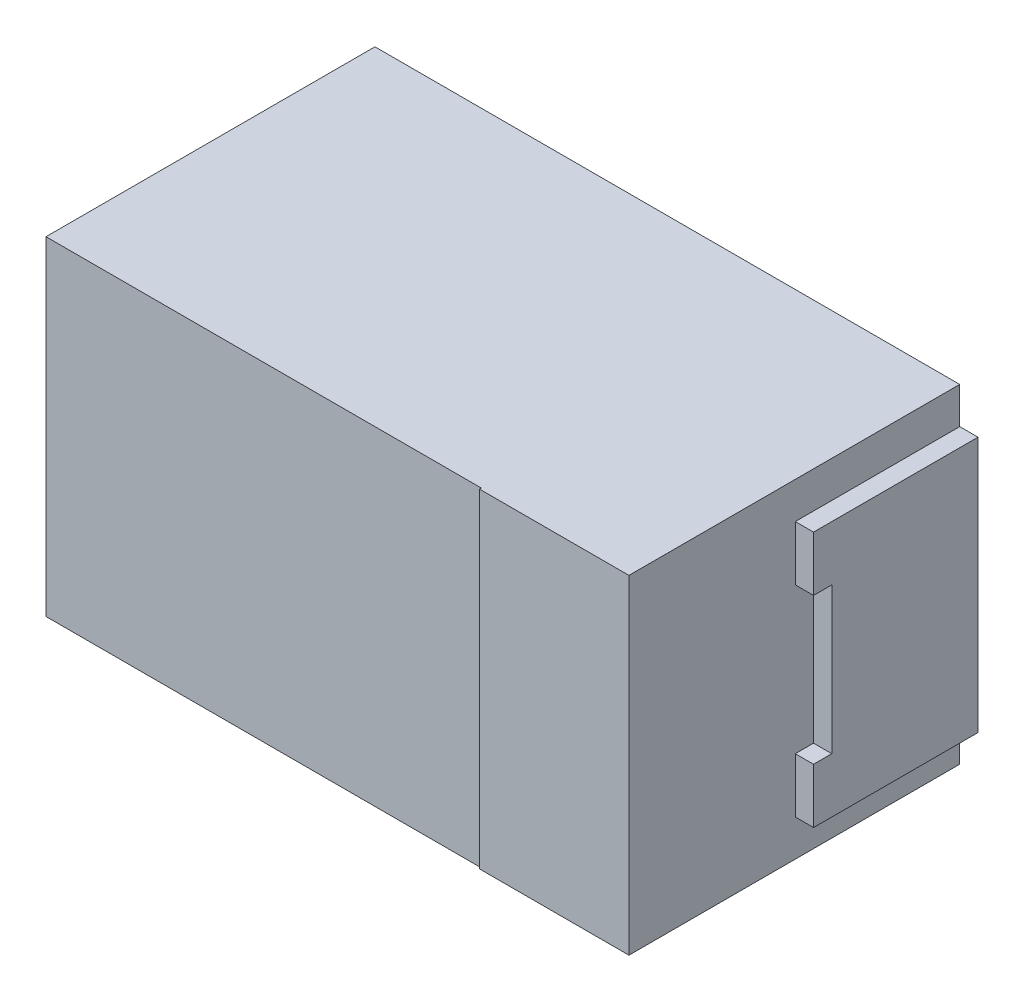
ISO-10303-21;
HEADER;
FILE_DESCRIPTION(('STEP AP214'),'2;1');
FILE_NAME('part.step','',(''),(''),'','','');
FILE_SCHEMA(('AUTOMOTIVE_DESIGN { 1 0 10303 214 1 1 1 1 }'));
ENDSEC;
DATA;
#1=APPLICATION_CONTEXT('core data for automotive mechanical design processes');
#2=APPLICATION_PROTOCOL_DEFINITION('international standard','automotive_design',2000,#1);
#3=PRODUCT_CONTEXT('',#1,'mechanical');
#4=PRODUCT('Part','Part','',(#3));
#5=PRODUCT_RELATED_PRODUCT_CATEGORY('part','',(#4));
#6=PRODUCT_DEFINITION_FORMATION('','',#4);
#7=PRODUCT_DEFINITION_CONTEXT('part definition',#1,'design');
#8=PRODUCT_DEFINITION('design','',#6,#7);
#9=PRODUCT_DEFINITION_SHAPE('','',#8);
#10=(LENGTH_UNIT() NAMED_UNIT(*) SI_UNIT(.MILLI.,.METRE.));
#11=(NAMED_UNIT(*) PLANE_ANGLE_UNIT() SI_UNIT($,.RADIAN.));
#12=(NAMED_UNIT(*) SI_UNIT($,.STERADIAN.) SOLID_ANGLE_UNIT());
#13=UNCERTAINTY_MEASURE_WITH_UNIT(LENGTH_MEASURE(1.E-05),#10,'distance_accuracy_value','');
#14=(GEOMETRIC_REPRESENTATION_CONTEXT(3) GLOBAL_UNCERTAINTY_ASSIGNED_CONTEXT((#13)) GLOBAL_UNIT_ASSIGNED_CONTEXT((#10,
#11,#12)) REPRESENTATION_CONTEXT('',''));
#15=CARTESIAN_POINT('',(0.,0.,0.));
#16=DIRECTION('',(0.,0.,1.));
#17=DIRECTION('',(1.,0.,0.));
#18=AXIS2_PLACEMENT_3D('',#15,#16,#17);
#19=CARTESIAN_POINT('',(1.5998781537962,0.899909005855458,1.80000003934025));
#20=DIRECTION('',(-0.999999999999985,-1.74845553146949E-07,0.));
#21=DIRECTION('',(1.74845553146949E-07,-0.999999999999984,-4.37113882867386E-08));
#22=AXIS2_PLACEMENT_3D('',#19,#20,#21);
#23=PLANE('',#22);
#24=DIRECTION('',(0.,-4.37113882867379E-08,0.999999999999999));
#25=VECTOR('',#24,1.);
#26=CARTESIAN_POINT('',(1.59987818876529,0.69990908453596,3.0597971800717E-08));
#27=LINE('',#26,#25);
#28=CARTESIAN_POINT('',(1.59987818876529,0.69990908453596,3.0597971800717E-08));
#29=VERTEX_POINT('',#28);
#30=CARTESIAN_POINT('',(1.5998781887653,0.699909045195711,0.900000030597971));
#31=VERTEX_POINT('',#30);
#32=EDGE_CURVE('E10',#29,#31,#27,.T.);
#33=ORIENTED_EDGE('',*,*,#32,.F.);
#34=DIRECTION('',(-1.74845553146949E-07,0.999999999999984,4.37113882867386E-08));
#35=VECTOR('',#34,1.);
#36=CARTESIAN_POINT('',(1.59987815379618,0.899909084535957,3.93402494580647E-08));
#37=LINE('',#36,#35);
#38=CARTESIAN_POINT('',(1.59987815379618,0.899909084535957,3.93402494580647E-08));
#39=VERTEX_POINT('',#38);
#40=EDGE_CURVE('E23',#29,#39,#37,.T.);
#41=ORIENTED_EDGE('',*,*,#40,.T.);
#42=DIRECTION('',(0.,4.37113882867379E-08,-0.999999999999999));
#43=VECTOR('',#42,1.);
#44=CARTESIAN_POINT('',(1.5998781537962,0.899909005855458,1.80000003934025));
#45=LINE('',#44,#43);
#46=CARTESIAN_POINT('',(1.5998781537962,0.899909005418344,1.81000003934025));
#47=VERTEX_POINT('',#46);
#48=EDGE_CURVE('E338',#47,#39,#45,.T.);
#49=ORIENTED_EDGE('',*,*,#48,.F.);
#50=DIRECTION('',(-1.74845553146949E-07,0.999999999999984,4.37113882867386E-08));
#51=VECTOR('',#50,1.);
#52=CARTESIAN_POINT('',(1.59987846851819,-0.900090994581627,1.80999996065975));
#53=LINE('',#52,#51);
#54=CARTESIAN_POINT('',(1.59987846851819,-0.900090994581627,1.80999996065975));
#55=VERTEX_POINT('',#54);
#56=EDGE_CURVE('E335',#55,#47,#53,.T.);
#57=ORIENTED_EDGE('',*,*,#56,.F.);
#58=DIRECTION('',(0.,4.37113882867379E-08,-0.999999999999999));
#59=VECTOR('',#58,1.);
#60=CARTESIAN_POINT('',(1.59987846851819,-0.900090994144513,1.79999996065975));
#61=LINE('',#60,#59);
#62=CARTESIAN_POINT('',(1.59987846851818,-0.900090915464014,-3.93402494580647E-08));
#63=VERTEX_POINT('',#62);
#64=EDGE_CURVE('E333',#55,#63,#61,.T.);
#65=ORIENTED_EDGE('',*,*,#64,.T.);
#66=DIRECTION('',(-1.74845553146949E-07,0.999999999999984,4.37113882867386E-08));
#67=VECTOR('',#66,1.);
#68=CARTESIAN_POINT('',(1.59987815379618,0.899909084535957,3.93402494580647E-08));
#69=LINE('',#68,#67);
#70=CARTESIAN_POINT('',(1.59987843354907,-0.700090915464017,-3.0597971800717E-08));
#71=VERTEX_POINT('',#70);
#72=EDGE_CURVE('E331',#63,#71,#69,.T.);
#73=ORIENTED_EDGE('',*,*,#72,.T.);
#74=DIRECTION('',(0.,4.37113885276717E-08,-0.999999999999999));
#75=VECTOR('',#74,1.);
#76=CARTESIAN_POINT('',(1.59987843354908,-0.700090954804267,0.899999969402027));
#77=LINE('',#76,#75);
#78=CARTESIAN_POINT('',(1.59987843354908,-0.700090954804267,0.899999969402027));
#79=VERTEX_POINT('',#78);
#80=EDGE_CURVE('E328',#79,#71,#77,.T.);
#81=ORIENTED_EDGE('',*,*,#80,.F.);
#82=DIRECTION('',(1.74845553146949E-07,-0.999999999999984,-4.37113882867386E-08));
#83=VECTOR('',#82,1.);
#84=CARTESIAN_POINT('',(1.59987838109541,-0.400090954804271,0.899999982515444));
#85=LINE('',#84,#83);
#86=CARTESIAN_POINT('',(1.59987838109541,-0.400090954804271,0.899999982515444));
#87=VERTEX_POINT('',#86);
#88=EDGE_CURVE('E325',#87,#79,#85,.T.);
#89=ORIENTED_EDGE('',*,*,#88,.F.);
#90=DIRECTION('',(0.,-4.37113882867379E-08,0.999999999999999));
#91=VECTOR('',#90,1.);
#92=CARTESIAN_POINT('',(1.59987838109541,-0.400090950433132,0.799999982515444));
#93=LINE('',#92,#91);
#94=CARTESIAN_POINT('',(1.59987838109541,-0.400090950433132,0.799999982515444));
#95=VERTEX_POINT('',#94);
#96=EDGE_CURVE('E323',#95,#87,#93,.T.);
#97=ORIENTED_EDGE('',*,*,#96,.F.);
#98=DIRECTION('',(1.74845553146949E-07,-0.999999999999984,-4.37113884222638E-08));
#99=VECTOR('',#98,1.);
#100=CARTESIAN_POINT('',(1.59987824121897,0.399909049566855,0.800000017484555));
#101=LINE('',#100,#99);
#102=CARTESIAN_POINT('',(1.59987824121897,0.399909049566855,0.800000017484555));
#103=VERTEX_POINT('',#102);
#104=EDGE_CURVE('E320',#103,#95,#101,.T.);
#105=ORIENTED_EDGE('',*,*,#104,.F.);
#106=DIRECTION('',(0.,4.37113882867379E-08,-0.999999999999999));
#107=VECTOR('',#106,1.);
#108=CARTESIAN_POINT('',(1.59987824121897,0.399909045195716,0.900000017484555));
#109=LINE('',#108,#107);
#110=CARTESIAN_POINT('',(1.59987824121897,0.399909045195716,0.900000017484555));
#111=VERTEX_POINT('',#110);
#112=EDGE_CURVE('E317',#111,#103,#109,.T.);
#113=ORIENTED_EDGE('',*,*,#112,.F.);
#114=DIRECTION('',(1.74845553146949E-07,-0.999999999999984,-4.37113882867386E-08));
#115=VECTOR('',#114,1.);
#116=CARTESIAN_POINT('',(1.5998781887653,0.699909045195711,0.900000030597971));
#117=LINE('',#116,#115);
#118=EDGE_CURVE('E314',#31,#111,#117,.T.);
#119=ORIENTED_EDGE('',*,*,#118,.F.);
#120=EDGE_LOOP('',(#33,#41,#49,#57,#65,#73,#81,#89,#97,#105,#113,#119));
#121=FACE_BOUND('',#120,.T.);
#122=ADVANCED_FACE('F16',(#121),#23,.F.);
#123=CARTESIAN_POINT('',(-1.60012184620375,0.899908446349688,1.80000003934025));
#124=DIRECTION('',(0.999999999999985,1.74845553402941E-07,0.));
#125=DIRECTION('',(-1.74845553402941E-07,0.999999999999984,4.37113882867386E-08));
#126=AXIS2_PLACEMENT_3D('',#123,#124,#125);
#127=PLANE('',#126);
#128=DIRECTION('',(1.74845553402941E-07,-0.999999999999984,-4.37113882867386E-08));
#129=VECTOR('',#128,1.);
#130=CARTESIAN_POINT('',(-1.60012184620377,0.899908525030187,3.93402494580647E-08));
#131=LINE('',#130,#129);
#132=CARTESIAN_POINT('',(-1.60012184620377,0.899908525030187,3.93402494580647E-08));
#133=VERTEX_POINT('',#132);
#134=CARTESIAN_POINT('',(-1.60012181123466,0.69990852503019,3.0597971800717E-08));
#135=VERTEX_POINT('',#134);
#136=EDGE_CURVE('E312',#133,#135,#131,.T.);
#137=ORIENTED_EDGE('',*,*,#136,.T.);
#138=DIRECTION('',(0.,-4.37113882867379E-08,0.999999999999999));
#139=VECTOR('',#138,1.);
#140=CARTESIAN_POINT('',(-1.60012181123466,0.69990852503019,3.0597971800717E-08));
#141=LINE('',#140,#139);
#142=CARTESIAN_POINT('',(-1.60012181123465,0.699908485689941,0.900000030597971));
#143=VERTEX_POINT('',#142);
#144=EDGE_CURVE('E309',#135,#143,#141,.T.);
#145=ORIENTED_EDGE('',*,*,#144,.T.);
#146=DIRECTION('',(1.74845553146949E-07,-0.999999999999984,-4.37113882867386E-08));
#147=VECTOR('',#146,1.);
#148=CARTESIAN_POINT('',(-1.60012181123465,0.699908485689941,0.900000030597971));
#149=LINE('',#148,#147);
#150=CARTESIAN_POINT('',(-1.60012175878098,0.399908485689946,0.900000017484555));
#151=VERTEX_POINT('',#150);
#152=EDGE_CURVE('E307',#143,#151,#149,.T.);
#153=ORIENTED_EDGE('',*,*,#152,.T.);
#154=DIRECTION('',(0.,4.37113882867379E-08,-0.999999999999999));
#155=VECTOR('',#154,1.);
#156=CARTESIAN_POINT('',(-1.60012175878098,0.399908485689946,0.900000017484555));
#157=LINE('',#156,#155);
#158=CARTESIAN_POINT('',(-1.60012175878099,0.399908490061084,0.800000017484555));
#159=VERTEX_POINT('',#158);
#160=EDGE_CURVE('E304',#151,#159,#157,.T.);
#161=ORIENTED_EDGE('',*,*,#160,.T.);
#162=DIRECTION('',(1.74845553146949E-07,-0.999999999999984,-4.37113884222638E-08));
#163=VECTOR('',#162,1.);
#164=CARTESIAN_POINT('',(-1.60012175878099,0.399908490061084,0.800000017484555));
#165=LINE('',#164,#163);
#166=CARTESIAN_POINT('',(-1.60012161890454,-0.400091509938903,0.799999982515444));
#167=VERTEX_POINT('',#166);
#168=EDGE_CURVE('E302',#159,#167,#165,.T.);
#169=ORIENTED_EDGE('',*,*,#168,.T.);
#170=DIRECTION('',(0.,-4.37113882867379E-08,0.999999999999999));
#171=VECTOR('',#170,1.);
#172=CARTESIAN_POINT('',(-1.60012161890454,-0.400091509938903,0.799999982515444));
#173=LINE('',#172,#171);
#174=CARTESIAN_POINT('',(-1.60012161890454,-0.400091514310041,0.899999982515444));
#175=VERTEX_POINT('',#174);
#176=EDGE_CURVE('E300',#167,#175,#173,.T.);
#177=ORIENTED_EDGE('',*,*,#176,.T.);
#178=DIRECTION('',(1.74845553146949E-07,-0.999999999999984,-4.37113882867386E-08));
#179=VECTOR('',#178,1.);
#180=CARTESIAN_POINT('',(-1.60012161890454,-0.400091514310041,0.899999982515444));
#181=LINE('',#180,#179);
#182=CARTESIAN_POINT('',(-1.60012156645088,-0.700091514310037,0.899999969402027));
#183=VERTEX_POINT('',#182);
#184=EDGE_CURVE('E298',#175,#183,#181,.T.);
#185=ORIENTED_EDGE('',*,*,#184,.T.);
#186=DIRECTION('',(0.,4.37113885276717E-08,-0.999999999999999));
#187=VECTOR('',#186,1.);
#188=CARTESIAN_POINT('',(-1.60012156645088,-0.700091514310037,0.899999969402027));
#189=LINE('',#188,#187);
#190=CARTESIAN_POINT('',(-1.60012156645088,-0.700091474969787,-3.0597971800717E-08));
#191=VERTEX_POINT('',#190);
#192=EDGE_CURVE('E178',#183,#191,#189,.T.);
#193=ORIENTED_EDGE('',*,*,#192,.T.);
#194=DIRECTION('',(1.74845553402941E-07,-0.999999999999984,-4.37113882867386E-08));
#195=VECTOR('',#194,1.);
#196=CARTESIAN_POINT('',(-1.60012184620377,0.899908525030187,3.93402494580647E-08));
#197=LINE('',#196,#195);
#198=CARTESIAN_POINT('',(-1.60012153148177,-0.900091474969784,-3.93402494580647E-08));
#199=VERTEX_POINT('',#198);
#200=EDGE_CURVE('E295',#191,#199,#197,.T.);
#201=ORIENTED_EDGE('',*,*,#200,.T.);
#202=DIRECTION('',(0.,4.37113882867379E-08,-0.999999999999999));
#203=VECTOR('',#202,1.);
#204=CARTESIAN_POINT('',(-1.60012153148176,-0.900091553650283,1.79999996065975));
#205=LINE('',#204,#203);
#206=CARTESIAN_POINT('',(-1.60012153148176,-0.900091553650283,1.79999996065975));
#207=VERTEX_POINT('',#206);
#208=EDGE_CURVE('E292',#207,#199,#205,.T.);
#209=ORIENTED_EDGE('',*,*,#208,.F.);
#210=DIRECTION('',(1.74845553402941E-07,-0.999999999999984,-4.37113882867386E-08));
#211=VECTOR('',#210,1.);
#212=CARTESIAN_POINT('',(-1.60012184620375,0.899908446349688,1.80000003934025));
#213=LINE('',#212,#211);
#214=CARTESIAN_POINT('',(-1.60012184620375,0.899908446349688,1.80000003934025));
#215=VERTEX_POINT('',#214);
#216=EDGE_CURVE('E289',#215,#207,#213,.T.);
#217=ORIENTED_EDGE('',*,*,#216,.F.);
#218=DIRECTION('',(0.,4.37113882867379E-08,-0.999999999999999));
#219=VECTOR('',#218,1.);
#220=CARTESIAN_POINT('',(-1.60012184620375,0.899908446349688,1.80000003934025));
#221=LINE('',#220,#219);
#222=EDGE_CURVE('E286',#215,#133,#221,.T.);
#223=ORIENTED_EDGE('',*,*,#222,.T.);
#224=EDGE_LOOP('',(#137,#145,#153,#161,#169,#177,#185,#193,#201,#209,#217,#223));
#225=FACE_BOUND('',#224,.T.);
#226=ADVANCED_FACE('F353',(#225),#127,.F.);
#227=CARTESIAN_POINT('',(-1.60012153148176,-0.900091553650283,1.79999996065975));
#228=DIRECTION('',(-1.74845553146949E-07,0.999999999999984,4.37113882867386E-08));
#229=DIRECTION('',(-0.999999999999985,-1.74845553146949E-07,0.));
#230=AXIS2_PLACEMENT_3D('',#227,#228,#229);
#231=PLANE('',#230);
#232=DIRECTION('',(0.999999999999985,1.74845553146949E-07,0.));
#233=VECTOR('',#232,1.);
#234=CARTESIAN_POINT('',(-1.60012153148177,-0.900091474969784,-3.93402494580647E-08));
#235=LINE('',#234,#233);
#236=EDGE_CURVE('E283',#199,#63,#235,.T.);
#237=ORIENTED_EDGE('',*,*,#236,.T.);
#238=ORIENTED_EDGE('',*,*,#64,.F.);
#239=DIRECTION('',(0.999999999999985,1.74845553146949E-07,0.));
#240=VECTOR('',#239,1.);
#241=CARTESIAN_POINT('',(0.782044103929914,-0.900091137576328,1.80999996065975));
#242=LINE('',#241,#240);
#243=CARTESIAN_POINT('',(0.782044103929914,-0.900091137576328,1.80999996065975));
#244=VERTEX_POINT('',#243);
#245=EDGE_CURVE('E280',#244,#55,#242,.T.);
#246=ORIENTED_EDGE('',*,*,#245,.F.);
#247=DIRECTION('',(0.,4.37113882867379E-08,-0.999999999999999));
#248=VECTOR('',#247,1.);
#249=CARTESIAN_POINT('',(0.782044103929914,-0.900091137576328,1.80999996065975));
#250=LINE('',#249,#248);
#251=CARTESIAN_POINT('',(0.782044103929914,-0.900091137139215,1.79999996065975));
#252=VERTEX_POINT('',#251);
#253=EDGE_CURVE('E278',#244,#252,#250,.T.);
#254=ORIENTED_EDGE('',*,*,#253,.T.);
#255=DIRECTION('',(0.999999999999985,1.74845553146949E-07,0.));
#256=VECTOR('',#255,1.);
#257=CARTESIAN_POINT('',(-1.60012153148176,-0.900091553650283,1.79999996065975));
#258=LINE('',#257,#256);
#259=EDGE_CURVE('E275',#207,#252,#258,.T.);
#260=ORIENTED_EDGE('',*,*,#259,.F.);
#261=ORIENTED_EDGE('',*,*,#208,.T.);
#262=EDGE_LOOP('',(#237,#238,#246,#254,#260,#261));
#263=FACE_BOUND('',#262,.T.);
#264=ADVANCED_FACE('F371',(#263),#231,.F.);
#265=CARTESIAN_POINT('',(-1.60012184620375,0.899908446349688,1.80000003934025));
#266=DIRECTION('',(1.74845553146949E-07,-0.999999999999984,-4.37113882867386E-08));
#267=DIRECTION('',(0.999999999999985,1.74845553146949E-07,0.));
#268=AXIS2_PLACEMENT_3D('',#265,#266,#267);
#269=PLANE('',#268);
#270=DIRECTION('',(-0.999999999999985,-1.74845553146949E-07,0.));
#271=VECTOR('',#270,1.);
#272=CARTESIAN_POINT('',(-1.60012184620377,0.899908525030187,3.93402494580647E-08));
#273=LINE('',#272,#271);
#274=EDGE_CURVE('E272',#39,#133,#273,.T.);
#275=ORIENTED_EDGE('',*,*,#274,.T.);
#276=ORIENTED_EDGE('',*,*,#222,.F.);
#277=DIRECTION('',(-0.999999999999985,-1.74845553146949E-07,0.));
#278=VECTOR('',#277,1.);
#279=CARTESIAN_POINT('',(-1.60012184620375,0.899908446349688,1.80000003934025));
#280=LINE('',#279,#278);
#281=CARTESIAN_POINT('',(0.782043789207919,0.899908862860756,1.80000003934025));
#282=VERTEX_POINT('',#281);
#283=EDGE_CURVE('E269',#282,#215,#280,.T.);
#284=ORIENTED_EDGE('',*,*,#283,.F.);
#285=DIRECTION('',(0.,4.37113882867379E-08,-0.999999999999999));
#286=VECTOR('',#285,1.);
#287=CARTESIAN_POINT('',(0.782043789207919,0.899908862423642,1.81000003934025));
#288=LINE('',#287,#286);
#289=CARTESIAN_POINT('',(0.782043789207919,0.899908862423642,1.81000003934025));
#290=VERTEX_POINT('',#289);
#291=EDGE_CURVE('E267',#290,#282,#288,.T.);
#292=ORIENTED_EDGE('',*,*,#291,.F.);
#293=DIRECTION('',(-0.999999999999985,-1.74845553146949E-07,0.));
#294=VECTOR('',#293,1.);
#295=CARTESIAN_POINT('',(0.782043789207919,0.899908862423642,1.81000003934025));
#296=LINE('',#295,#294);
#297=EDGE_CURVE('E264',#47,#290,#296,.T.);
#298=ORIENTED_EDGE('',*,*,#297,.F.);
#299=ORIENTED_EDGE('',*,*,#48,.T.);
#300=EDGE_LOOP('',(#275,#276,#284,#292,#298,#299));
#301=FACE_BOUND('',#300,.T.);
#302=ADVANCED_FACE('F346',(#301),#269,.F.);
#303=CARTESIAN_POINT('',(-1.60012153148176,-0.900091553650283,1.79999996065975));
#304=DIRECTION('',(0.,-4.37113882867379E-08,0.999999999999999));
#305=DIRECTION('',(1.74845553146949E-07,-0.999999999999984,-4.37113882867386E-08));
#306=AXIS2_PLACEMENT_3D('',#303,#304,#305);
#307=PLANE('',#306);
#308=DIRECTION('',(1.74845553146949E-07,-0.999999999999984,-4.37113882867386E-08));
#309=VECTOR('',#308,1.);
#310=CARTESIAN_POINT('',(0.782044103929914,-0.900091137139215,1.79999996065975));
#311=LINE('',#310,#309);
#312=EDGE_CURVE('E261',#282,#252,#311,.T.);
#313=ORIENTED_EDGE('',*,*,#312,.F.);
#314=ORIENTED_EDGE('',*,*,#283,.T.);
#315=ORIENTED_EDGE('',*,*,#216,.T.);
#316=ORIENTED_EDGE('',*,*,#259,.T.);
#317=EDGE_LOOP('',(#313,#314,#315,#316));
#318=FACE_BOUND('',#317,.T.);
#319=ADVANCED_FACE('F357',(#318),#307,.T.);
#320=CARTESIAN_POINT('',(-1.60012153148177,-0.900091474969784,-3.93402494580647E-08));
#321=DIRECTION('',(0.,-4.37113882867379E-08,0.999999999999999));
#322=DIRECTION('',(1.74845553146949E-07,-0.999999999999984,-4.37113882867386E-08));
#323=AXIS2_PLACEMENT_3D('',#320,#321,#322);
#324=PLANE('',#323);
#325=ORIENTED_EDGE('',*,*,#136,.F.);
#326=ORIENTED_EDGE('',*,*,#274,.F.);
#327=ORIENTED_EDGE('',*,*,#40,.F.);
#328=DIRECTION('',(-0.999999999999985,-1.74845553146949E-07,0.));
#329=VECTOR('',#328,1.);
#330=CARTESIAN_POINT('',(1.69987818876529,0.699909102020516,3.0597971800717E-08));
#331=LINE('',#330,#329);
#332=CARTESIAN_POINT('',(1.69987818876529,0.699909102020516,3.0597971800717E-08));
#333=VERTEX_POINT('',#332);
#334=EDGE_CURVE('E259',#333,#29,#331,.T.);
#335=ORIENTED_EDGE('',*,*,#334,.F.);
#336=DIRECTION('',(-1.74845553146949E-07,0.999999999999984,4.37113882867386E-08));
#337=VECTOR('',#336,1.);
#338=CARTESIAN_POINT('',(1.69987843354907,-0.700090897979462,-3.0597971800717E-08));
#339=LINE('',#338,#337);
#340=CARTESIAN_POINT('',(1.69987843354907,-0.700090897979462,-3.0597971800717E-08));
#341=VERTEX_POINT('',#340);
#342=EDGE_CURVE('E256',#341,#333,#339,.T.);
#343=ORIENTED_EDGE('',*,*,#342,.F.);
#344=DIRECTION('',(-0.999999999999985,-1.74845553146949E-07,0.));
#345=VECTOR('',#344,1.);
#346=CARTESIAN_POINT('',(1.69987843354907,-0.700090897979462,-3.0597971800717E-08));
#347=LINE('',#346,#345);
#348=EDGE_CURVE('E253',#341,#71,#347,.T.);
#349=ORIENTED_EDGE('',*,*,#348,.T.);
#350=ORIENTED_EDGE('',*,*,#72,.F.);
#351=ORIENTED_EDGE('',*,*,#236,.F.);
#352=ORIENTED_EDGE('',*,*,#200,.F.);
#353=DIRECTION('',(-0.999999999999985,-1.74845553146949E-07,0.));
#354=VECTOR('',#353,1.);
#355=CARTESIAN_POINT('',(-1.60012156645088,-0.700091474969787,-3.0597971800717E-08));
#356=LINE('',#355,#354);
#357=CARTESIAN_POINT('',(-1.70012156645088,-0.700091492454342,-3.0597971800717E-08));
#358=VERTEX_POINT('',#357);
#359=EDGE_CURVE('E251',#191,#358,#356,.T.);
#360=ORIENTED_EDGE('',*,*,#359,.T.);
#361=DIRECTION('',(-1.74845553146949E-07,0.999999999999984,4.37113882867386E-08));
#362=VECTOR('',#361,1.);
#363=CARTESIAN_POINT('',(-1.70012156645088,-0.700091492454342,-3.0597971800717E-08));
#364=LINE('',#363,#362);
#365=CARTESIAN_POINT('',(-1.70012181123466,0.699908507545635,3.0597971800717E-08));
#366=VERTEX_POINT('',#365);
#367=EDGE_CURVE('E183',#358,#366,#364,.T.);
#368=ORIENTED_EDGE('',*,*,#367,.T.);
#369=DIRECTION('',(-0.999999999999985,-1.74845553146949E-07,0.));
#370=VECTOR('',#369,1.);
#371=CARTESIAN_POINT('',(-1.60012181123466,0.69990852503019,3.0597971800717E-08));
#372=LINE('',#371,#370);
#373=EDGE_CURVE('E247',#135,#366,#372,.T.);
#374=ORIENTED_EDGE('',*,*,#373,.F.);
#375=EDGE_LOOP('',(#325,#326,#327,#335,#343,#349,#350,#351,#352,#360,#368,#374));
#376=FACE_BOUND('',#375,.T.);
#377=ADVANCED_FACE('F349',(#376),#324,.F.);
#378=CARTESIAN_POINT('',(0.782044103929914,-0.900091137576329,1.80999996065975));
#379=DIRECTION('',(0.999999999999985,1.74845553146949E-07,0.));
#380=DIRECTION('',(-1.74845553146949E-07,0.999999999999984,4.37113882867386E-08));
#381=AXIS2_PLACEMENT_3D('',#378,#379,#380);
#382=PLANE('',#381);
#383=ORIENTED_EDGE('',*,*,#312,.T.);
#384=ORIENTED_EDGE('',*,*,#253,.F.);
#385=DIRECTION('',(1.74845553146949E-07,-0.999999999999984,-4.37113882867386E-08));
#386=VECTOR('',#385,1.);
#387=CARTESIAN_POINT('',(0.782044103929914,-0.900091137576328,1.80999996065975));
#388=LINE('',#387,#386);
#389=EDGE_CURVE('E245',#290,#244,#388,.T.);
#390=ORIENTED_EDGE('',*,*,#389,.F.);
#391=ORIENTED_EDGE('',*,*,#291,.T.);
#392=EDGE_LOOP('',(#383,#384,#390,#391));
#393=FACE_BOUND('',#392,.T.);
#394=ADVANCED_FACE('F361',(#393),#382,.F.);
#395=CARTESIAN_POINT('',(0.782043789207919,0.899908862423642,1.81000003934025));
#396=DIRECTION('',(0.,4.37113882867379E-08,-0.999999999999999));
#397=DIRECTION('',(-1.74845553146949E-07,0.999999999999984,4.37113882867386E-08));
#398=AXIS2_PLACEMENT_3D('',#395,#396,#397);
#399=PLANE('',#398);
#400=ORIENTED_EDGE('',*,*,#389,.T.);
#401=ORIENTED_EDGE('',*,*,#245,.T.);
#402=ORIENTED_EDGE('',*,*,#56,.T.);
#403=ORIENTED_EDGE('',*,*,#297,.T.);
#404=EDGE_LOOP('',(#400,#401,#402,#403));
#405=FACE_BOUND('',#404,.T.);
#406=ADVANCED_FACE('F363',(#405),#399,.F.);
#407=CARTESIAN_POINT('',(1.69987818876529,0.699909102020516,3.0597971800717E-08));
#408=DIRECTION('',(1.74845553146949E-07,-0.999999999999984,-4.37113882867386E-08));
#409=DIRECTION('',(0.999999999999985,1.74845553146949E-07,0.));
#410=AXIS2_PLACEMENT_3D('',#407,#408,#409);
#411=PLANE('',#410);
#412=ORIENTED_EDGE('',*,*,#32,.T.);
#413=DIRECTION('',(-0.999999999999985,-1.74845553146949E-07,0.));
#414=VECTOR('',#413,1.);
#415=CARTESIAN_POINT('',(1.6998781887653,0.699909062680266,0.900000030597971));
#416=LINE('',#415,#414);
#417=CARTESIAN_POINT('',(1.6998781887653,0.699909062680266,0.900000030597971));
#418=VERTEX_POINT('',#417);
#419=EDGE_CURVE('E242',#418,#31,#416,.T.);
#420=ORIENTED_EDGE('',*,*,#419,.F.);
#421=DIRECTION('',(0.,-4.37113882867379E-08,0.999999999999999));
#422=VECTOR('',#421,1.);
#423=CARTESIAN_POINT('',(1.69987818876529,0.699909102020516,3.0597971800717E-08));
#424=LINE('',#423,#422);
#425=EDGE_CURVE('E240',#333,#418,#424,.T.);
#426=ORIENTED_EDGE('',*,*,#425,.F.);
#427=ORIENTED_EDGE('',*,*,#334,.T.);
#428=EDGE_LOOP('',(#412,#420,#426,#427));
#429=FACE_BOUND('',#428,.T.);
#430=ADVANCED_FACE('F418',(#429),#411,.F.);
#431=CARTESIAN_POINT('',(1.6998781887653,0.699909062680266,0.900000030597971));
#432=DIRECTION('',(0.,4.37113882867379E-08,-0.999999999999999));
#433=DIRECTION('',(-1.74845553146949E-07,0.999999999999984,4.37113882867386E-08));
#434=AXIS2_PLACEMENT_3D('',#431,#432,#433);
#435=PLANE('',#434);
#436=ORIENTED_EDGE('',*,*,#118,.T.);
#437=DIRECTION('',(-0.999999999999985,-1.74845553146949E-07,0.));
#438=VECTOR('',#437,1.);
#439=CARTESIAN_POINT('',(1.69987824121897,0.399909062680271,0.900000017484555));
#440=LINE('',#439,#438);
#441=CARTESIAN_POINT('',(1.69987824121897,0.399909062680271,0.900000017484555));
#442=VERTEX_POINT('',#441);
#443=EDGE_CURVE('E238',#442,#111,#440,.T.);
#444=ORIENTED_EDGE('',*,*,#443,.F.);
#445=DIRECTION('',(1.74845553146949E-07,-0.999999999999984,-4.37113882867386E-08));
#446=VECTOR('',#445,1.);
#447=CARTESIAN_POINT('',(1.6998781887653,0.699909062680266,0.900000030597971));
#448=LINE('',#447,#446);
#449=EDGE_CURVE('E235',#418,#442,#448,.T.);
#450=ORIENTED_EDGE('',*,*,#449,.F.);
#451=ORIENTED_EDGE('',*,*,#419,.T.);
#452=EDGE_LOOP('',(#436,#444,#450,#451));
#453=FACE_BOUND('',#452,.T.);
#454=ADVANCED_FACE('F421',(#453),#435,.F.);
#455=CARTESIAN_POINT('',(1.69987824121897,0.399909062680271,0.900000017484555));
#456=DIRECTION('',(-1.74845553146949E-07,0.999999999999984,4.37113882867386E-08));
#457=DIRECTION('',(-0.999999999999985,-1.74845553146949E-07,0.));
#458=AXIS2_PLACEMENT_3D('',#455,#456,#457);
#459=PLANE('',#458);
#460=ORIENTED_EDGE('',*,*,#112,.T.);
#461=DIRECTION('',(-0.999999999999985,-1.74845553146949E-07,0.));
#462=VECTOR('',#461,1.);
#463=CARTESIAN_POINT('',(1.69987824121897,0.39990906705141,0.800000017484555));
#464=LINE('',#463,#462);
#465=CARTESIAN_POINT('',(1.69987824121897,0.39990906705141,0.800000017484555));
#466=VERTEX_POINT('',#465);
#467=EDGE_CURVE('E232',#466,#103,#464,.T.);
#468=ORIENTED_EDGE('',*,*,#467,.F.);
#469=DIRECTION('',(0.,4.37113882867379E-08,-0.999999999999999));
#470=VECTOR('',#469,1.);
#471=CARTESIAN_POINT('',(1.69987824121897,0.399909062680271,0.900000017484555));
#472=LINE('',#471,#470);
#473=EDGE_CURVE('E229',#442,#466,#472,.T.);
#474=ORIENTED_EDGE('',*,*,#473,.F.);
#475=ORIENTED_EDGE('',*,*,#443,.T.);
#476=EDGE_LOOP('',(#460,#468,#474,#475));
#477=FACE_BOUND('',#476,.T.);
#478=ADVANCED_FACE('F424',(#477),#459,.F.);
#479=CARTESIAN_POINT('',(1.69987824121897,0.39990906705141,0.800000017484555));
#480=DIRECTION('',(0.,4.37113884222632E-08,-0.999999999999999));
#481=DIRECTION('',(-1.74845553146949E-07,0.999999999999984,4.37113884222638E-08));
#482=AXIS2_PLACEMENT_3D('',#479,#480,#481);
#483=PLANE('',#482);
#484=ORIENTED_EDGE('',*,*,#104,.T.);
#485=DIRECTION('',(-0.999999999999985,-1.74845553146949E-07,0.));
#486=VECTOR('',#485,1.);
#487=CARTESIAN_POINT('',(1.69987838109541,-0.400090932948577,0.799999982515444));
#488=LINE('',#487,#486);
#489=CARTESIAN_POINT('',(1.69987838109541,-0.400090932948577,0.799999982515444));
#490=VERTEX_POINT('',#489);
#491=EDGE_CURVE('E226',#490,#95,#488,.T.);
#492=ORIENTED_EDGE('',*,*,#491,.F.);
#493=DIRECTION('',(1.74845553146949E-07,-0.999999999999984,-4.37113884222638E-08));
#494=VECTOR('',#493,1.);
#495=CARTESIAN_POINT('',(1.69987824121897,0.39990906705141,0.800000017484555));
#496=LINE('',#495,#494);
#497=EDGE_CURVE('E223',#466,#490,#496,.T.);
#498=ORIENTED_EDGE('',*,*,#497,.F.);
#499=ORIENTED_EDGE('',*,*,#467,.T.);
#500=EDGE_LOOP('',(#484,#492,#498,#499));
#501=FACE_BOUND('',#500,.T.);
#502=ADVANCED_FACE('F428',(#501),#483,.F.);
#503=CARTESIAN_POINT('',(1.69987838109541,-0.400090932948577,0.799999982515444));
#504=DIRECTION('',(1.74845553146949E-07,-0.999999999999984,-4.37113882867386E-08));
#505=DIRECTION('',(0.999999999999985,1.74845553146949E-07,0.));
#506=AXIS2_PLACEMENT_3D('',#503,#504,#505);
#507=PLANE('',#506);
#508=ORIENTED_EDGE('',*,*,#96,.T.);
#509=DIRECTION('',(-0.999999999999985,-1.74845553146949E-07,0.));
#510=VECTOR('',#509,1.);
#511=CARTESIAN_POINT('',(1.69987838109541,-0.400090937319716,0.899999982515444));
#512=LINE('',#511,#510);
#513=CARTESIAN_POINT('',(1.69987838109541,-0.400090937319716,0.899999982515444));
#514=VERTEX_POINT('',#513);
#515=EDGE_CURVE('E220',#514,#87,#512,.T.);
#516=ORIENTED_EDGE('',*,*,#515,.F.);
#517=DIRECTION('',(0.,-4.37113882867379E-08,0.999999999999999));
#518=VECTOR('',#517,1.);
#519=CARTESIAN_POINT('',(1.69987838109541,-0.400090932948577,0.799999982515444));
#520=LINE('',#519,#518);
#521=EDGE_CURVE('E218',#490,#514,#520,.T.);
#522=ORIENTED_EDGE('',*,*,#521,.F.);
#523=ORIENTED_EDGE('',*,*,#491,.T.);
#524=EDGE_LOOP('',(#508,#516,#522,#523));
#525=FACE_BOUND('',#524,.T.);
#526=ADVANCED_FACE('F432',(#525),#507,.F.);
#527=CARTESIAN_POINT('',(1.69987838109541,-0.400090937319716,0.899999982515444));
#528=DIRECTION('',(0.,4.37113882867379E-08,-0.999999999999999));
#529=DIRECTION('',(-1.74845553146949E-07,0.999999999999984,4.37113882867386E-08));
#530=AXIS2_PLACEMENT_3D('',#527,#528,#529);
#531=PLANE('',#530);
#532=ORIENTED_EDGE('',*,*,#88,.T.);
#533=DIRECTION('',(-0.999999999999985,-1.74845553146949E-07,0.));
#534=VECTOR('',#533,1.);
#535=CARTESIAN_POINT('',(1.69987843354907,-0.700090937319711,0.899999969402027));
#536=LINE('',#535,#534);
#537=CARTESIAN_POINT('',(1.69987843354907,-0.700090937319711,0.899999969402027));
#538=VERTEX_POINT('',#537);
#539=EDGE_CURVE('E216',#538,#79,#536,.T.);
#540=ORIENTED_EDGE('',*,*,#539,.F.);
#541=DIRECTION('',(1.74845553146949E-07,-0.999999999999984,-4.37113882867386E-08));
#542=VECTOR('',#541,1.);
#543=CARTESIAN_POINT('',(1.69987838109541,-0.400090937319716,0.899999982515444));
#544=LINE('',#543,#542);
#545=EDGE_CURVE('E213',#514,#538,#544,.T.);
#546=ORIENTED_EDGE('',*,*,#545,.F.);
#547=ORIENTED_EDGE('',*,*,#515,.T.);
#548=EDGE_LOOP('',(#532,#540,#546,#547));
#549=FACE_BOUND('',#548,.T.);
#550=ADVANCED_FACE('F436',(#549),#531,.F.);
#551=CARTESIAN_POINT('',(1.69987843354907,-0.700090937319711,0.899999969402027));
#552=DIRECTION('',(-1.74845553146949E-07,0.999999999999984,4.37113885276724E-08));
#553=DIRECTION('',(0.,-4.37113885276717E-08,0.999999999999999));
#554=AXIS2_PLACEMENT_3D('',#551,#552,#553);
#555=PLANE('',#554);
#556=ORIENTED_EDGE('',*,*,#80,.T.);
#557=ORIENTED_EDGE('',*,*,#348,.F.);
#558=DIRECTION('',(0.,4.37113885276717E-08,-0.999999999999999));
#559=VECTOR('',#558,1.);
#560=CARTESIAN_POINT('',(1.69987843354907,-0.700090937319711,0.899999969402027));
#561=LINE('',#560,#559);
#562=EDGE_CURVE('E210',#538,#341,#561,.T.);
#563=ORIENTED_EDGE('',*,*,#562,.F.);
#564=ORIENTED_EDGE('',*,*,#539,.T.);
#565=EDGE_LOOP('',(#556,#557,#563,#564));
#566=FACE_BOUND('',#565,.T.);
#567=ADVANCED_FACE('F440',(#566),#555,.F.);
#568=CARTESIAN_POINT('',(1.6998781887653,0.699909062680266,0.900000030597971));
#569=DIRECTION('',(0.999999999999985,1.74845553146949E-07,0.));
#570=DIRECTION('',(-1.74845553146949E-07,0.999999999999984,4.37113882867386E-08));
#571=AXIS2_PLACEMENT_3D('',#568,#569,#570);
#572=PLANE('',#571);
#573=ORIENTED_EDGE('',*,*,#425,.T.);
#574=ORIENTED_EDGE('',*,*,#449,.T.);
#575=ORIENTED_EDGE('',*,*,#473,.T.);
#576=ORIENTED_EDGE('',*,*,#497,.T.);
#577=ORIENTED_EDGE('',*,*,#521,.T.);
#578=ORIENTED_EDGE('',*,*,#545,.T.);
#579=ORIENTED_EDGE('',*,*,#562,.T.);
#580=ORIENTED_EDGE('',*,*,#342,.T.);
#581=EDGE_LOOP('',(#573,#574,#575,#576,#577,#578,#579,#580));
#582=FACE_BOUND('',#581,.T.);
#583=ADVANCED_FACE('F444',(#582),#572,.T.);
#584=CARTESIAN_POINT('',(-1.60012181123466,0.69990852503019,3.0597971800717E-08));
#585=DIRECTION('',(1.74845553146949E-07,-0.999999999999984,-4.37113882867386E-08));
#586=DIRECTION('',(0.999999999999985,1.74845553146949E-07,0.));
#587=AXIS2_PLACEMENT_3D('',#584,#585,#586);
#588=PLANE('',#587);
#589=DIRECTION('',(0.,-4.37113882867379E-08,0.999999999999999));
#590=VECTOR('',#589,1.);
#591=CARTESIAN_POINT('',(-1.70012181123466,0.699908507545635,3.0597971800717E-08));
#592=LINE('',#591,#590);
#593=CARTESIAN_POINT('',(-1.70012181123465,0.699908468205386,0.900000030597971));
#594=VERTEX_POINT('',#593);
#595=EDGE_CURVE('E208',#366,#594,#592,.T.);
#596=ORIENTED_EDGE('',*,*,#595,.T.);
#597=DIRECTION('',(-0.999999999999985,-1.74845553146949E-07,0.));
#598=VECTOR('',#597,1.);
#599=CARTESIAN_POINT('',(-1.60012181123465,0.699908485689941,0.900000030597971));
#600=LINE('',#599,#598);
#601=EDGE_CURVE('E205',#143,#594,#600,.T.);
#602=ORIENTED_EDGE('',*,*,#601,.F.);
#603=ORIENTED_EDGE('',*,*,#144,.F.);
#604=ORIENTED_EDGE('',*,*,#373,.T.);
#605=EDGE_LOOP('',(#596,#602,#603,#604));
#606=FACE_BOUND('',#605,.T.);
#607=ADVANCED_FACE('F373',(#606),#588,.F.);
#608=CARTESIAN_POINT('',(-1.60012181123465,0.699908485689941,0.900000030597971));
#609=DIRECTION('',(0.,4.37113882867379E-08,-0.999999999999999));
#610=DIRECTION('',(-1.74845553146949E-07,0.999999999999984,4.37113882867386E-08));
#611=AXIS2_PLACEMENT_3D('',#608,#609,#610);
#612=PLANE('',#611);
#613=DIRECTION('',(1.74845553146949E-07,-0.999999999999984,-4.37113882867386E-08));
#614=VECTOR('',#613,1.);
#615=CARTESIAN_POINT('',(-1.70012181123465,0.699908468205386,0.900000030597971));
#616=LINE('',#615,#614);
#617=CARTESIAN_POINT('',(-1.70012175878098,0.39990846820539,0.900000017484555));
#618=VERTEX_POINT('',#617);
#619=EDGE_CURVE('E202',#594,#618,#616,.T.);
#620=ORIENTED_EDGE('',*,*,#619,.T.);
#621=DIRECTION('',(-0.999999999999985,-1.74845553146949E-07,0.));
#622=VECTOR('',#621,1.);
#623=CARTESIAN_POINT('',(-1.60012175878098,0.399908485689946,0.900000017484555));
#624=LINE('',#623,#622);
#625=EDGE_CURVE('E199',#151,#618,#624,.T.);
#626=ORIENTED_EDGE('',*,*,#625,.F.);
#627=ORIENTED_EDGE('',*,*,#152,.F.);
#628=ORIENTED_EDGE('',*,*,#601,.T.);
#629=EDGE_LOOP('',(#620,#626,#627,#628));
#630=FACE_BOUND('',#629,.T.);
#631=ADVANCED_FACE('F378',(#630),#612,.F.);
#632=CARTESIAN_POINT('',(-1.60012175878098,0.399908485689946,0.900000017484555));
#633=DIRECTION('',(-1.74845553146949E-07,0.999999999999984,4.37113882867386E-08));
#634=DIRECTION('',(-0.999999999999985,-1.74845553146949E-07,0.));
#635=AXIS2_PLACEMENT_3D('',#632,#633,#634);
#636=PLANE('',#635);
#637=DIRECTION('',(0.,4.37113882867379E-08,-0.999999999999999));
#638=VECTOR('',#637,1.);
#639=CARTESIAN_POINT('',(-1.70012175878098,0.39990846820539,0.900000017484555));
#640=LINE('',#639,#638);
#641=CARTESIAN_POINT('',(-1.70012175878098,0.399908472576529,0.800000017484555));
#642=VERTEX_POINT('',#641);
#643=EDGE_CURVE('E197',#618,#642,#640,.T.);
#644=ORIENTED_EDGE('',*,*,#643,.T.);
#645=DIRECTION('',(-0.999999999999985,-1.74845553146949E-07,0.));
#646=VECTOR('',#645,1.);
#647=CARTESIAN_POINT('',(-1.60012175878099,0.399908490061084,0.800000017484555));
#648=LINE('',#647,#646);
#649=EDGE_CURVE('E194',#159,#642,#648,.T.);
#650=ORIENTED_EDGE('',*,*,#649,.F.);
#651=ORIENTED_EDGE('',*,*,#160,.F.);
#652=ORIENTED_EDGE('',*,*,#625,.T.);
#653=EDGE_LOOP('',(#644,#650,#651,#652));
#654=FACE_BOUND('',#653,.T.);
#655=ADVANCED_FACE('F382',(#654),#636,.F.);
#656=CARTESIAN_POINT('',(-1.60012175878099,0.399908490061084,0.800000017484555));
#657=DIRECTION('',(0.,4.37113884222632E-08,-0.999999999999999));
#658=DIRECTION('',(-1.74845553146949E-07,0.999999999999984,4.37113884222638E-08));
#659=AXIS2_PLACEMENT_3D('',#656,#657,#658);
#660=PLANE('',#659);
#661=DIRECTION('',(1.74845553146949E-07,-0.999999999999984,-4.37113884222638E-08));
#662=VECTOR('',#661,1.);
#663=CARTESIAN_POINT('',(-1.70012175878098,0.399908472576529,0.800000017484555));
#664=LINE('',#663,#662);
#665=CARTESIAN_POINT('',(-1.70012161890454,-0.400091527423458,0.799999982515444));
#666=VERTEX_POINT('',#665);
#667=EDGE_CURVE('E192',#642,#666,#664,.T.);
#668=ORIENTED_EDGE('',*,*,#667,.T.);
#669=DIRECTION('',(-0.999999999999985,-1.74845553146949E-07,0.));
#670=VECTOR('',#669,1.);
#671=CARTESIAN_POINT('',(-1.60012161890454,-0.400091509938903,0.799999982515444));
#672=LINE('',#671,#670);
#673=EDGE_CURVE('E189',#167,#666,#672,.T.);
#674=ORIENTED_EDGE('',*,*,#673,.F.);
#675=ORIENTED_EDGE('',*,*,#168,.F.);
#676=ORIENTED_EDGE('',*,*,#649,.T.);
#677=EDGE_LOOP('',(#668,#674,#675,#676));
#678=FACE_BOUND('',#677,.T.);
#679=ADVANCED_FACE('F385',(#678),#660,.F.);
#680=CARTESIAN_POINT('',(-1.60012161890454,-0.400091509938903,0.799999982515444));
#681=DIRECTION('',(1.74845553146949E-07,-0.999999999999984,-4.37113882867386E-08));
#682=DIRECTION('',(0.999999999999985,1.74845553146949E-07,0.));
#683=AXIS2_PLACEMENT_3D('',#680,#681,#682);
#684=PLANE('',#683);
#685=DIRECTION('',(0.,-4.37113882867379E-08,0.999999999999999));
#686=VECTOR('',#685,1.);
#687=CARTESIAN_POINT('',(-1.70012161890454,-0.400091527423458,0.799999982515444));
#688=LINE('',#687,#686);
#689=CARTESIAN_POINT('',(-1.70012161890454,-0.400091531794597,0.899999982515444));
#690=VERTEX_POINT('',#689);
#691=EDGE_CURVE('E187',#666,#690,#688,.T.);
#692=ORIENTED_EDGE('',*,*,#691,.T.);
#693=DIRECTION('',(-0.999999999999985,-1.74845553146949E-07,0.));
#694=VECTOR('',#693,1.);
#695=CARTESIAN_POINT('',(-1.60012161890454,-0.400091514310041,0.899999982515444));
#696=LINE('',#695,#694);
#697=EDGE_CURVE('E167',#175,#690,#696,.T.);
#698=ORIENTED_EDGE('',*,*,#697,.F.);
#699=ORIENTED_EDGE('',*,*,#176,.F.);
#700=ORIENTED_EDGE('',*,*,#673,.T.);
#701=EDGE_LOOP('',(#692,#698,#699,#700));
#702=FACE_BOUND('',#701,.T.);
#703=ADVANCED_FACE('F388',(#702),#684,.F.);
#704=CARTESIAN_POINT('',(-1.60012161890454,-0.400091514310041,0.899999982515444));
#705=DIRECTION('',(0.,4.37113882867379E-08,-0.999999999999999));
#706=DIRECTION('',(-1.74845553146949E-07,0.999999999999984,4.37113882867386E-08));
#707=AXIS2_PLACEMENT_3D('',#704,#705,#706);
#708=PLANE('',#707);
#709=DIRECTION('',(1.74845553146949E-07,-0.999999999999984,-4.37113882867386E-08));
#710=VECTOR('',#709,1.);
#711=CARTESIAN_POINT('',(-1.70012161890454,-0.400091531794597,0.899999982515444));
#712=LINE('',#711,#710);
#713=CARTESIAN_POINT('',(-1.70012156645087,-0.700091531794592,0.899999969402027));
#714=VERTEX_POINT('',#713);
#715=EDGE_CURVE('E161',#690,#714,#712,.T.);
#716=ORIENTED_EDGE('',*,*,#715,.T.);
#717=DIRECTION('',(-0.999999999999985,-1.74845553146949E-07,0.));
#718=VECTOR('',#717,1.);
#719=CARTESIAN_POINT('',(-1.60012156645088,-0.700091514310037,0.899999969402027));
#720=LINE('',#719,#718);
#721=EDGE_CURVE('E165',#183,#714,#720,.T.);
#722=ORIENTED_EDGE('',*,*,#721,.F.);
#723=ORIENTED_EDGE('',*,*,#184,.F.);
#724=ORIENTED_EDGE('',*,*,#697,.T.);
#725=EDGE_LOOP('',(#716,#722,#723,#724));
#726=FACE_BOUND('',#725,.T.);
#727=ADVANCED_FACE('F163',(#726),#708,.F.);
#728=CARTESIAN_POINT('',(-1.60012156645088,-0.700091514310037,0.899999969402027));
#729=DIRECTION('',(-1.74845553146949E-07,0.999999999999984,4.37113885276724E-08));
#730=DIRECTION('',(0.,-4.37113885276717E-08,0.999999999999999));
#731=AXIS2_PLACEMENT_3D('',#728,#729,#730);
#732=PLANE('',#731);
#733=DIRECTION('',(0.,4.37113885276717E-08,-0.999999999999999));
#734=VECTOR('',#733,1.);
#735=CARTESIAN_POINT('',(-1.70012156645087,-0.700091531794592,0.899999969402027));
#736=LINE('',#735,#734);
#737=EDGE_CURVE('E176',#714,#358,#736,.T.);
#738=ORIENTED_EDGE('',*,*,#737,.T.);
#739=ORIENTED_EDGE('',*,*,#359,.F.);
#740=ORIENTED_EDGE('',*,*,#192,.F.);
#741=ORIENTED_EDGE('',*,*,#721,.T.);
#742=EDGE_LOOP('',(#738,#739,#740,#741));
#743=FACE_BOUND('',#742,.T.);
#744=ADVANCED_FACE('F175',(#743),#732,.F.);
#745=CARTESIAN_POINT('',(-1.70012181123465,0.699908468205386,0.900000030597971));
#746=DIRECTION('',(0.999999999999985,1.74845553146949E-07,0.));
#747=DIRECTION('',(-1.74845553146949E-07,0.999999999999984,4.37113882867386E-08));
#748=AXIS2_PLACEMENT_3D('',#745,#746,#747);
#749=PLANE('',#748);
#750=ORIENTED_EDGE('',*,*,#595,.F.);
#751=ORIENTED_EDGE('',*,*,#367,.F.);
#752=ORIENTED_EDGE('',*,*,#737,.F.);
#753=ORIENTED_EDGE('',*,*,#715,.F.);
#754=ORIENTED_EDGE('',*,*,#691,.F.);
#755=ORIENTED_EDGE('',*,*,#667,.F.);
#756=ORIENTED_EDGE('',*,*,#643,.F.);
#757=ORIENTED_EDGE('',*,*,#619,.F.);
#758=EDGE_LOOP('',(#750,#751,#752,#753,#754,#755,#756,#757));
#759=FACE_BOUND('',#758,.T.);
#760=ADVANCED_FACE('F181',(#759),#749,.F.);
#761=CLOSED_SHELL('',(#122,#226,#264,#302,#319,#377,#394,#406,#430,#454,#478,#502,#526,#550,
#567,#583,#607,#631,#655,#679,#703,#727,#744,#760));
#762=MANIFOLD_SOLID_BREP('B1',#761);
#763=ADVANCED_BREP_SHAPE_REPRESENTATION('',(#18,#762),#14);
#764=SHAPE_DEFINITION_REPRESENTATION(#9,#763);
ENDSEC;
END-ISO-10303-21;
